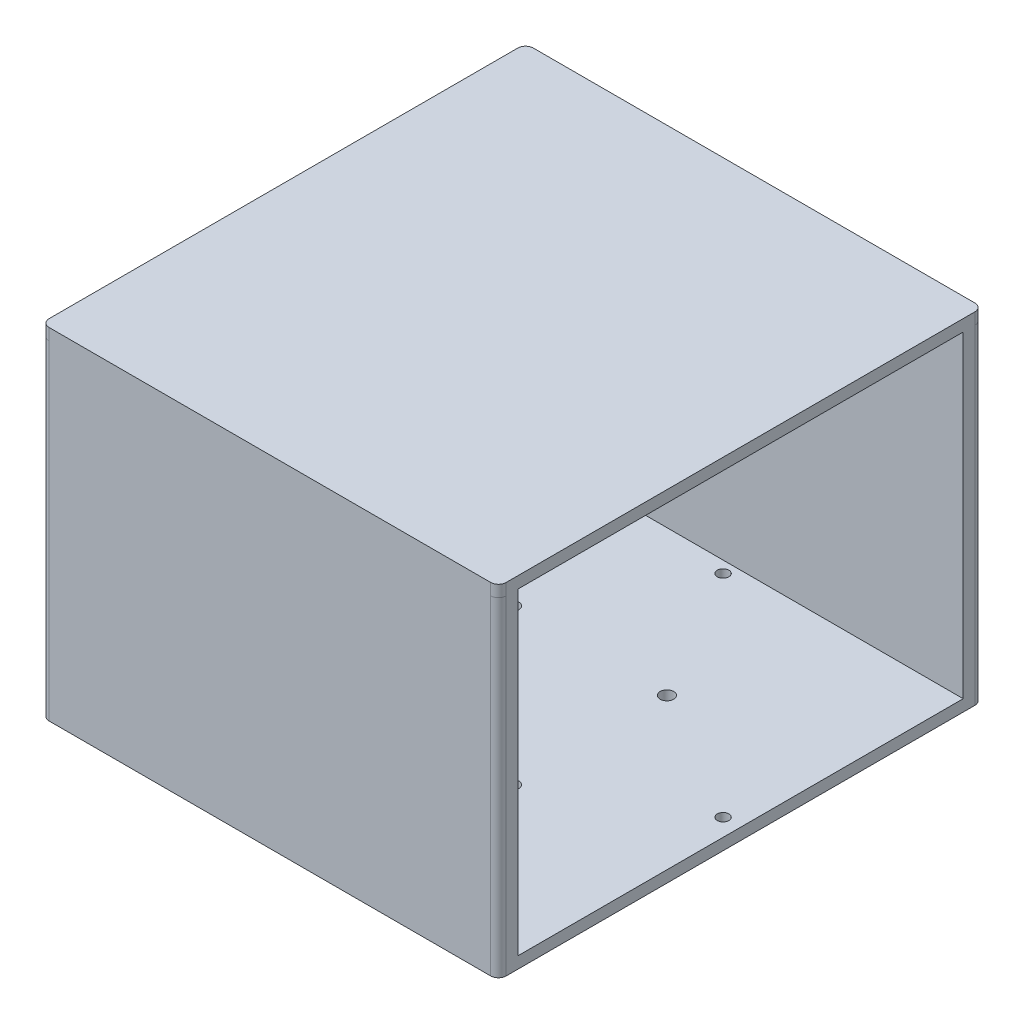
ISO-10303-21;
HEADER;
FILE_DESCRIPTION(('STEP AP214'),'2;1');
FILE_NAME('part.step','',(''),(''),'','','');
FILE_SCHEMA(('AUTOMOTIVE_DESIGN { 1 0 10303 214 1 1 1 1 }'));
ENDSEC;
DATA;
#1=APPLICATION_CONTEXT('core data for automotive mechanical design processes');
#2=APPLICATION_PROTOCOL_DEFINITION('international standard','automotive_design',2000,#1);
#3=PRODUCT_CONTEXT('',#1,'mechanical');
#4=PRODUCT('Part','Part','',(#3));
#5=PRODUCT_RELATED_PRODUCT_CATEGORY('part','',(#4));
#6=PRODUCT_DEFINITION_FORMATION('','',#4);
#7=PRODUCT_DEFINITION_CONTEXT('part definition',#1,'design');
#8=PRODUCT_DEFINITION('design','',#6,#7);
#9=PRODUCT_DEFINITION_SHAPE('','',#8);
#10=(LENGTH_UNIT() NAMED_UNIT(*) SI_UNIT(.MILLI.,.METRE.));
#11=(NAMED_UNIT(*) PLANE_ANGLE_UNIT() SI_UNIT($,.RADIAN.));
#12=(NAMED_UNIT(*) SI_UNIT($,.STERADIAN.) SOLID_ANGLE_UNIT());
#13=UNCERTAINTY_MEASURE_WITH_UNIT(LENGTH_MEASURE(1.E-05),#10,'distance_accuracy_value','');
#14=(GEOMETRIC_REPRESENTATION_CONTEXT(3) GLOBAL_UNCERTAINTY_ASSIGNED_CONTEXT((#13)) GLOBAL_UNIT_ASSIGNED_CONTEXT((#10,
#11,#12)) REPRESENTATION_CONTEXT('',''));
#15=CARTESIAN_POINT('',(0.,0.,0.));
#16=DIRECTION('',(0.,0.,1.));
#17=DIRECTION('',(1.,0.,0.));
#18=AXIS2_PLACEMENT_3D('',#15,#16,#17);
#19=CARTESIAN_POINT('',(0.,3.,0.));
#20=DIRECTION('',(0.,-1.,0.));
#21=DIRECTION('',(0.,0.,-1.));
#22=AXIS2_PLACEMENT_3D('',#19,#20,#21);
#23=PLANE('',#22);
#24=CARTESIAN_POINT('',(-20.,3.,20.));
#25=DIRECTION('',(0.,-1.,0.));
#26=DIRECTION('',(0.,0.,-1.));
#27=AXIS2_PLACEMENT_3D('',#24,#25,#26);
#28=CIRCLE('',#27,1.75);
#29=CARTESIAN_POINT('',(-20.,3.,18.25));
#30=VERTEX_POINT('',#29);
#31=EDGE_CURVE('E289',#30,#30,#28,.T.);
#32=ORIENTED_EDGE('',*,*,#31,.T.);
#33=EDGE_LOOP('',(#32));
#34=FACE_BOUND('',#33,.T.);
#35=CARTESIAN_POINT('',(20.,3.,20.));
#36=DIRECTION('',(0.,-1.,0.));
#37=DIRECTION('',(0.,0.,-1.));
#38=AXIS2_PLACEMENT_3D('',#35,#36,#37);
#39=CIRCLE('',#38,1.75);
#40=CARTESIAN_POINT('',(20.,3.,18.25));
#41=VERTEX_POINT('',#40);
#42=EDGE_CURVE('E294',#41,#41,#39,.T.);
#43=ORIENTED_EDGE('',*,*,#42,.T.);
#44=EDGE_LOOP('',(#43));
#45=FACE_BOUND('',#44,.T.);
#46=CARTESIAN_POINT('',(20.,3.,-20.));
#47=DIRECTION('',(0.,-1.,0.));
#48=DIRECTION('',(0.,0.,-1.));
#49=AXIS2_PLACEMENT_3D('',#46,#47,#48);
#50=CIRCLE('',#49,1.75);
#51=CARTESIAN_POINT('',(20.,3.,-21.75));
#52=VERTEX_POINT('',#51);
#53=EDGE_CURVE('E297',#52,#52,#50,.T.);
#54=ORIENTED_EDGE('',*,*,#53,.T.);
#55=EDGE_LOOP('',(#54));
#56=FACE_BOUND('',#55,.T.);
#57=CARTESIAN_POINT('',(-20.,3.,-20.));
#58=DIRECTION('',(0.,-1.,0.));
#59=DIRECTION('',(0.,0.,-1.));
#60=AXIS2_PLACEMENT_3D('',#57,#58,#59);
#61=CIRCLE('',#60,1.75);
#62=CARTESIAN_POINT('',(-20.,3.,-21.75));
#63=VERTEX_POINT('',#62);
#64=EDGE_CURVE('E300',#63,#63,#61,.T.);
#65=ORIENTED_EDGE('',*,*,#64,.T.);
#66=EDGE_LOOP('',(#65));
#67=FACE_BOUND('',#66,.T.);
#68=CARTESIAN_POINT('',(-54.5,3.,0.));
#69=DIRECTION('',(0.,1.,0.));
#70=DIRECTION('',(0.,0.,1.));
#71=AXIS2_PLACEMENT_3D('',#68,#69,#70);
#72=CIRCLE('',#71,1.5);
#73=CARTESIAN_POINT('',(-54.5,3.,1.5));
#74=VERTEX_POINT('',#73);
#75=EDGE_CURVE('E265',#74,#74,#72,.T.);
#76=ORIENTED_EDGE('',*,*,#75,.F.);
#77=EDGE_LOOP('',(#76));
#78=FACE_BOUND('',#77,.T.);
#79=CARTESIAN_POINT('',(0.,3.,-54.5));
#80=DIRECTION('',(0.,1.,0.));
#81=DIRECTION('',(0.,0.,1.));
#82=AXIS2_PLACEMENT_3D('',#79,#80,#81);
#83=CIRCLE('',#82,1.5);
#84=CARTESIAN_POINT('',(0.,3.,-53.));
#85=VERTEX_POINT('',#84);
#86=EDGE_CURVE('E272',#85,#85,#83,.T.);
#87=ORIENTED_EDGE('',*,*,#86,.F.);
#88=EDGE_LOOP('',(#87));
#89=FACE_BOUND('',#88,.T.);
#90=CARTESIAN_POINT('',(54.5,3.,0.));
#91=DIRECTION('',(0.,1.,0.));
#92=DIRECTION('',(0.,0.,1.));
#93=AXIS2_PLACEMENT_3D('',#90,#91,#92);
#94=CIRCLE('',#93,1.5);
#95=CARTESIAN_POINT('',(54.5,3.,1.5));
#96=VERTEX_POINT('',#95);
#97=EDGE_CURVE('E277',#96,#96,#94,.T.);
#98=ORIENTED_EDGE('',*,*,#97,.F.);
#99=EDGE_LOOP('',(#98));
#100=FACE_BOUND('',#99,.T.);
#101=CARTESIAN_POINT('',(0.,3.,54.5));
#102=DIRECTION('',(0.,1.,0.));
#103=DIRECTION('',(0.,0.,1.));
#104=AXIS2_PLACEMENT_3D('',#101,#102,#103);
#105=CIRCLE('',#104,1.5);
#106=CARTESIAN_POINT('',(0.,3.,56.));
#107=VERTEX_POINT('',#106);
#108=EDGE_CURVE('E283',#107,#107,#105,.T.);
#109=ORIENTED_EDGE('',*,*,#108,.F.);
#110=EDGE_LOOP('',(#109));
#111=FACE_BOUND('',#110,.T.);
#112=DIRECTION('',(1.,0.,0.));
#113=VECTOR('',#112,1.);
#114=CARTESIAN_POINT('',(59.,3.,-57.5));
#115=LINE('',#114,#113);
#116=CARTESIAN_POINT('',(-59.,3.,-57.5));
#117=VERTEX_POINT('',#116);
#118=CARTESIAN_POINT('',(59.,3.,-57.5));
#119=VERTEX_POINT('',#118);
#120=EDGE_CURVE('E334',#117,#119,#115,.T.);
#121=ORIENTED_EDGE('',*,*,#120,.F.);
#122=DIRECTION('',(0.,0.,1.));
#123=VECTOR('',#122,1.);
#124=CARTESIAN_POINT('',(-59.,3.,-62.5));
#125=LINE('',#124,#123);
#126=CARTESIAN_POINT('',(-59.,3.,57.5));
#127=VERTEX_POINT('',#126);
#128=EDGE_CURVE('E249',#117,#127,#125,.T.);
#129=ORIENTED_EDGE('',*,*,#128,.T.);
#130=DIRECTION('',(-1.,0.,0.));
#131=VECTOR('',#130,1.);
#132=CARTESIAN_POINT('',(59.,3.,57.5));
#133=LINE('',#132,#131);
#134=CARTESIAN_POINT('',(59.,3.,57.5));
#135=VERTEX_POINT('',#134);
#136=EDGE_CURVE('E322',#135,#127,#133,.T.);
#137=ORIENTED_EDGE('',*,*,#136,.F.);
#138=DIRECTION('',(0.,0.,-1.));
#139=VECTOR('',#138,1.);
#140=CARTESIAN_POINT('',(59.,3.,-62.5));
#141=LINE('',#140,#139);
#142=EDGE_CURVE('E254',#135,#119,#141,.T.);
#143=ORIENTED_EDGE('',*,*,#142,.T.);
#144=EDGE_LOOP('',(#121,#129,#137,#143));
#145=FACE_BOUND('',#144,.T.);
#146=ADVANCED_FACE('F33',(#34,#45,#56,#67,#78,#89,#100,#111,#145),#23,.F.);
#147=CARTESIAN_POINT('',(0.,0.,0.));
#148=DIRECTION('',(0.,-1.,0.));
#149=DIRECTION('',(0.,0.,-1.));
#150=AXIS2_PLACEMENT_3D('',#147,#148,#149);
#151=PLANE('',#150);
#152=CARTESIAN_POINT('',(-20.,0.,20.));
#153=DIRECTION('',(0.,-1.,0.));
#154=DIRECTION('',(0.,0.,-1.));
#155=AXIS2_PLACEMENT_3D('',#152,#153,#154);
#156=CIRCLE('',#155,1.75);
#157=CARTESIAN_POINT('',(-20.,0.,18.25));
#158=VERTEX_POINT('',#157);
#159=EDGE_CURVE('E307',#158,#158,#156,.T.);
#160=ORIENTED_EDGE('',*,*,#159,.F.);
#161=EDGE_LOOP('',(#160));
#162=FACE_BOUND('',#161,.T.);
#163=CARTESIAN_POINT('',(20.,0.,20.));
#164=DIRECTION('',(0.,-1.,0.));
#165=DIRECTION('',(0.,0.,-1.));
#166=AXIS2_PLACEMENT_3D('',#163,#164,#165);
#167=CIRCLE('',#166,1.75);
#168=CARTESIAN_POINT('',(20.,0.,18.25));
#169=VERTEX_POINT('',#168);
#170=EDGE_CURVE('E310',#169,#169,#167,.T.);
#171=ORIENTED_EDGE('',*,*,#170,.F.);
#172=EDGE_LOOP('',(#171));
#173=FACE_BOUND('',#172,.T.);
#174=CARTESIAN_POINT('',(20.,0.,-20.));
#175=DIRECTION('',(0.,-1.,0.));
#176=DIRECTION('',(0.,0.,-1.));
#177=AXIS2_PLACEMENT_3D('',#174,#175,#176);
#178=CIRCLE('',#177,1.75);
#179=CARTESIAN_POINT('',(20.,0.,-21.75));
#180=VERTEX_POINT('',#179);
#181=EDGE_CURVE('E306',#180,#180,#178,.T.);
#182=ORIENTED_EDGE('',*,*,#181,.F.);
#183=EDGE_LOOP('',(#182));
#184=FACE_BOUND('',#183,.T.);
#185=CARTESIAN_POINT('',(-20.,0.,-20.));
#186=DIRECTION('',(0.,-1.,0.));
#187=DIRECTION('',(0.,0.,-1.));
#188=AXIS2_PLACEMENT_3D('',#185,#186,#187);
#189=CIRCLE('',#188,1.75);
#190=CARTESIAN_POINT('',(-20.,0.,-21.75));
#191=VERTEX_POINT('',#190);
#192=EDGE_CURVE('E303',#191,#191,#189,.T.);
#193=ORIENTED_EDGE('',*,*,#192,.F.);
#194=EDGE_LOOP('',(#193));
#195=FACE_BOUND('',#194,.T.);
#196=CARTESIAN_POINT('',(54.5,0.,0.));
#197=DIRECTION('',(0.,1.,0.));
#198=DIRECTION('',(0.,0.,1.));
#199=AXIS2_PLACEMENT_3D('',#196,#197,#198);
#200=CIRCLE('',#199,1.5);
#201=CARTESIAN_POINT('',(54.5,0.,1.5));
#202=VERTEX_POINT('',#201);
#203=EDGE_CURVE('E280',#202,#202,#200,.T.);
#204=ORIENTED_EDGE('',*,*,#203,.T.);
#205=EDGE_LOOP('',(#204));
#206=FACE_BOUND('',#205,.T.);
#207=CARTESIAN_POINT('',(-54.5,0.,0.));
#208=DIRECTION('',(0.,1.,0.));
#209=DIRECTION('',(0.,0.,1.));
#210=AXIS2_PLACEMENT_3D('',#207,#208,#209);
#211=CIRCLE('',#210,1.5);
#212=CARTESIAN_POINT('',(-54.5,0.,1.5));
#213=VERTEX_POINT('',#212);
#214=EDGE_CURVE('E267',#213,#213,#211,.T.);
#215=ORIENTED_EDGE('',*,*,#214,.T.);
#216=EDGE_LOOP('',(#215));
#217=FACE_BOUND('',#216,.T.);
#218=DIRECTION('',(0.,0.,1.));
#219=VECTOR('',#218,1.);
#220=CARTESIAN_POINT('',(-59.,0.,-62.5));
#221=LINE('',#220,#219);
#222=CARTESIAN_POINT('',(-59.,0.,-60.5));
#223=VERTEX_POINT('',#222);
#224=CARTESIAN_POINT('',(-59.,0.,60.5));
#225=VERTEX_POINT('',#224);
#226=EDGE_CURVE('E251',#223,#225,#221,.T.);
#227=ORIENTED_EDGE('',*,*,#226,.F.);
#228=CARTESIAN_POINT('',(-57.,0.,-60.5));
#229=DIRECTION('',(0.,-1.,0.));
#230=DIRECTION('',(0.,0.,-1.));
#231=AXIS2_PLACEMENT_3D('',#228,#229,#230);
#232=CIRCLE('',#231,2.);
#233=CARTESIAN_POINT('',(-57.,0.,-62.5));
#234=VERTEX_POINT('',#233);
#235=EDGE_CURVE('E172',#223,#234,#232,.T.);
#236=ORIENTED_EDGE('',*,*,#235,.T.);
#237=DIRECTION('',(-1.,0.,0.));
#238=VECTOR('',#237,1.);
#239=CARTESIAN_POINT('',(59.,0.,-62.5));
#240=LINE('',#239,#238);
#241=CARTESIAN_POINT('',(57.,0.,-62.5));
#242=VERTEX_POINT('',#241);
#243=EDGE_CURVE('E246',#242,#234,#240,.T.);
#244=ORIENTED_EDGE('',*,*,#243,.F.);
#245=CARTESIAN_POINT('',(57.,0.,-60.5));
#246=DIRECTION('',(0.,-1.,0.));
#247=DIRECTION('',(0.,0.,-1.));
#248=AXIS2_PLACEMENT_3D('',#245,#246,#247);
#249=CIRCLE('',#248,2.);
#250=CARTESIAN_POINT('',(59.,0.,-60.5));
#251=VERTEX_POINT('',#250);
#252=EDGE_CURVE('E171',#242,#251,#249,.T.);
#253=ORIENTED_EDGE('',*,*,#252,.T.);
#254=DIRECTION('',(0.,0.,-1.));
#255=VECTOR('',#254,1.);
#256=CARTESIAN_POINT('',(59.,0.,-62.5));
#257=LINE('',#256,#255);
#258=CARTESIAN_POINT('',(59.,0.,60.5));
#259=VERTEX_POINT('',#258);
#260=EDGE_CURVE('E245',#259,#251,#257,.T.);
#261=ORIENTED_EDGE('',*,*,#260,.F.);
#262=CARTESIAN_POINT('',(57.,0.,60.5));
#263=DIRECTION('',(0.,-1.,0.));
#264=DIRECTION('',(0.,0.,-1.));
#265=AXIS2_PLACEMENT_3D('',#262,#263,#264);
#266=CIRCLE('',#265,2.);
#267=CARTESIAN_POINT('',(57.,0.,62.5));
#268=VERTEX_POINT('',#267);
#269=EDGE_CURVE('E231',#259,#268,#266,.T.);
#270=ORIENTED_EDGE('',*,*,#269,.T.);
#271=DIRECTION('',(1.,0.,0.));
#272=VECTOR('',#271,1.);
#273=CARTESIAN_POINT('',(59.,0.,62.5));
#274=LINE('',#273,#272);
#275=CARTESIAN_POINT('',(-57.,0.,62.5));
#276=VERTEX_POINT('',#275);
#277=EDGE_CURVE('E247',#276,#268,#274,.T.);
#278=ORIENTED_EDGE('',*,*,#277,.F.);
#279=CARTESIAN_POINT('',(-57.,0.,60.5));
#280=DIRECTION('',(0.,-1.,0.));
#281=DIRECTION('',(0.,0.,-1.));
#282=AXIS2_PLACEMENT_3D('',#279,#280,#281);
#283=CIRCLE('',#282,2.);
#284=EDGE_CURVE('E234',#276,#225,#283,.T.);
#285=ORIENTED_EDGE('',*,*,#284,.T.);
#286=EDGE_LOOP('',(#227,#236,#244,#253,#261,#270,#278,#285));
#287=FACE_BOUND('',#286,.T.);
#288=CARTESIAN_POINT('',(0.,0.,-54.5));
#289=DIRECTION('',(0.,1.,0.));
#290=DIRECTION('',(0.,0.,1.));
#291=AXIS2_PLACEMENT_3D('',#288,#289,#290);
#292=CIRCLE('',#291,1.5);
#293=CARTESIAN_POINT('',(0.,0.,-53.));
#294=VERTEX_POINT('',#293);
#295=EDGE_CURVE('E274',#294,#294,#292,.T.);
#296=ORIENTED_EDGE('',*,*,#295,.T.);
#297=EDGE_LOOP('',(#296));
#298=FACE_BOUND('',#297,.T.);
#299=CARTESIAN_POINT('',(0.,0.,54.5));
#300=DIRECTION('',(0.,1.,0.));
#301=DIRECTION('',(0.,0.,1.));
#302=AXIS2_PLACEMENT_3D('',#299,#300,#301);
#303=CIRCLE('',#302,1.5);
#304=CARTESIAN_POINT('',(0.,0.,56.));
#305=VERTEX_POINT('',#304);
#306=EDGE_CURVE('E286',#305,#305,#303,.T.);
#307=ORIENTED_EDGE('',*,*,#306,.T.);
#308=EDGE_LOOP('',(#307));
#309=FACE_BOUND('',#308,.T.);
#310=ADVANCED_FACE('F243',(#162,#173,#184,#195,#206,#217,#287,#298,#309),#151,.T.);
#311=CARTESIAN_POINT('',(-59.,3.,-62.5));
#312=DIRECTION('',(1.,0.,0.));
#313=DIRECTION('',(0.,0.,-1.));
#314=AXIS2_PLACEMENT_3D('',#311,#312,#313);
#315=PLANE('',#314);
#316=DIRECTION('',(0.,0.,1.));
#317=VECTOR('',#316,1.);
#318=CARTESIAN_POINT('',(-59.,88.,-62.5));
#319=LINE('',#318,#317);
#320=CARTESIAN_POINT('',(-59.,88.,-60.5));
#321=VERTEX_POINT('',#320);
#322=CARTESIAN_POINT('',(-59.,88.,60.5));
#323=VERTEX_POINT('',#322);
#324=EDGE_CURVE('E222',#321,#323,#319,.T.);
#325=ORIENTED_EDGE('',*,*,#324,.F.);
#326=DIRECTION('',(0.,-1.,0.));
#327=VECTOR('',#326,1.);
#328=CARTESIAN_POINT('',(-59.,3.,-60.5));
#329=LINE('',#328,#327);
#330=CARTESIAN_POINT('',(-59.,85.,-60.5));
#331=VERTEX_POINT('',#330);
#332=EDGE_CURVE('E168',#321,#331,#329,.T.);
#333=ORIENTED_EDGE('',*,*,#332,.T.);
#334=DIRECTION('',(0.,-1.,0.));
#335=VECTOR('',#334,1.);
#336=CARTESIAN_POINT('',(-59.,3.,-60.5));
#337=LINE('',#336,#335);
#338=EDGE_CURVE('E235',#331,#223,#337,.T.);
#339=ORIENTED_EDGE('',*,*,#338,.T.);
#340=ORIENTED_EDGE('',*,*,#226,.T.);
#341=DIRECTION('',(0.,-1.,0.));
#342=VECTOR('',#341,1.);
#343=CARTESIAN_POINT('',(-59.,3.,60.5));
#344=LINE('',#343,#342);
#345=CARTESIAN_POINT('',(-59.,85.,60.5));
#346=VERTEX_POINT('',#345);
#347=EDGE_CURVE('E239',#225,#346,#344,.F.);
#348=ORIENTED_EDGE('',*,*,#347,.T.);
#349=DIRECTION('',(0.,-1.,0.));
#350=VECTOR('',#349,1.);
#351=CARTESIAN_POINT('',(-59.,3.,60.5));
#352=LINE('',#351,#350);
#353=EDGE_CURVE('E193',#346,#323,#352,.F.);
#354=ORIENTED_EDGE('',*,*,#353,.T.);
#355=EDGE_LOOP('',(#325,#333,#339,#340,#348,#354));
#356=FACE_BOUND('',#355,.T.);
#357=DIRECTION('',(0.,-1.,0.));
#358=VECTOR('',#357,1.);
#359=CARTESIAN_POINT('',(-59.,85.,-57.5));
#360=LINE('',#359,#358);
#361=CARTESIAN_POINT('',(-59.,85.,-57.5));
#362=VERTEX_POINT('',#361);
#363=EDGE_CURVE('E325',#362,#117,#360,.T.);
#364=ORIENTED_EDGE('',*,*,#363,.F.);
#365=DIRECTION('',(0.,0.,1.));
#366=VECTOR('',#365,1.);
#367=CARTESIAN_POINT('',(-59.,85.,-62.5));
#368=LINE('',#367,#366);
#369=CARTESIAN_POINT('',(-59.,85.,57.5));
#370=VERTEX_POINT('',#369);
#371=EDGE_CURVE('E341',#362,#370,#368,.T.);
#372=ORIENTED_EDGE('',*,*,#371,.T.);
#373=DIRECTION('',(0.,-1.,0.));
#374=VECTOR('',#373,1.);
#375=CARTESIAN_POINT('',(-59.,85.,57.5));
#376=LINE('',#375,#374);
#377=EDGE_CURVE('E318',#370,#127,#376,.T.);
#378=ORIENTED_EDGE('',*,*,#377,.T.);
#379=ORIENTED_EDGE('',*,*,#128,.F.);
#380=EDGE_LOOP('',(#364,#372,#378,#379));
#381=FACE_BOUND('',#380,.T.);
#382=ADVANCED_FACE('F363',(#356,#381),#315,.F.);
#383=CARTESIAN_POINT('',(59.,3.,62.5));
#384=DIRECTION('',(0.,0.,-1.));
#385=DIRECTION('',(-1.,0.,0.));
#386=AXIS2_PLACEMENT_3D('',#383,#384,#385);
#387=PLANE('',#386);
#388=DIRECTION('',(1.,0.,0.));
#389=VECTOR('',#388,1.);
#390=CARTESIAN_POINT('',(59.,88.,62.5));
#391=LINE('',#390,#389);
#392=CARTESIAN_POINT('',(-57.,88.,62.5));
#393=VERTEX_POINT('',#392);
#394=CARTESIAN_POINT('',(57.,88.,62.5));
#395=VERTEX_POINT('',#394);
#396=EDGE_CURVE('E212',#393,#395,#391,.T.);
#397=ORIENTED_EDGE('',*,*,#396,.F.);
#398=DIRECTION('',(0.,-1.,0.));
#399=VECTOR('',#398,1.);
#400=CARTESIAN_POINT('',(-57.,3.,62.5));
#401=LINE('',#400,#399);
#402=CARTESIAN_POINT('',(-57.,85.,62.5));
#403=VERTEX_POINT('',#402);
#404=EDGE_CURVE('E11',#393,#403,#401,.T.);
#405=ORIENTED_EDGE('',*,*,#404,.T.);
#406=DIRECTION('',(0.,-1.,0.));
#407=VECTOR('',#406,1.);
#408=CARTESIAN_POINT('',(-57.,3.,62.5));
#409=LINE('',#408,#407);
#410=EDGE_CURVE('E186',#403,#276,#409,.T.);
#411=ORIENTED_EDGE('',*,*,#410,.T.);
#412=ORIENTED_EDGE('',*,*,#277,.T.);
#413=DIRECTION('',(0.,-1.,0.));
#414=VECTOR('',#413,1.);
#415=CARTESIAN_POINT('',(57.,3.,62.5));
#416=LINE('',#415,#414);
#417=CARTESIAN_POINT('',(57.,85.,62.5));
#418=VERTEX_POINT('',#417);
#419=EDGE_CURVE('E184',#268,#418,#416,.F.);
#420=ORIENTED_EDGE('',*,*,#419,.T.);
#421=DIRECTION('',(0.,-1.,0.));
#422=VECTOR('',#421,1.);
#423=CARTESIAN_POINT('',(57.,3.,62.5));
#424=LINE('',#423,#422);
#425=EDGE_CURVE('E41',#418,#395,#424,.F.);
#426=ORIENTED_EDGE('',*,*,#425,.T.);
#427=EDGE_LOOP('',(#397,#405,#411,#412,#420,#426));
#428=FACE_BOUND('',#427,.T.);
#429=ADVANCED_FACE('F211',(#428),#387,.F.);
#430=CARTESIAN_POINT('',(59.,3.,-62.5));
#431=DIRECTION('',(-1.,0.,0.));
#432=DIRECTION('',(0.,0.,1.));
#433=AXIS2_PLACEMENT_3D('',#430,#431,#432);
#434=PLANE('',#433);
#435=DIRECTION('',(0.,-1.,0.));
#436=VECTOR('',#435,1.);
#437=CARTESIAN_POINT('',(59.,85.,57.5));
#438=LINE('',#437,#436);
#439=CARTESIAN_POINT('',(59.,85.,57.5));
#440=VERTEX_POINT('',#439);
#441=EDGE_CURVE('E311',#440,#135,#438,.T.);
#442=ORIENTED_EDGE('',*,*,#441,.F.);
#443=DIRECTION('',(0.,0.,-1.));
#444=VECTOR('',#443,1.);
#445=CARTESIAN_POINT('',(59.,85.,-62.5));
#446=LINE('',#445,#444);
#447=CARTESIAN_POINT('',(59.,85.,-57.5));
#448=VERTEX_POINT('',#447);
#449=EDGE_CURVE('E338',#440,#448,#446,.T.);
#450=ORIENTED_EDGE('',*,*,#449,.T.);
#451=DIRECTION('',(0.,-1.,0.));
#452=VECTOR('',#451,1.);
#453=CARTESIAN_POINT('',(59.,85.,-57.5));
#454=LINE('',#453,#452);
#455=EDGE_CURVE('E330',#448,#119,#454,.T.);
#456=ORIENTED_EDGE('',*,*,#455,.T.);
#457=ORIENTED_EDGE('',*,*,#142,.F.);
#458=EDGE_LOOP('',(#442,#450,#456,#457));
#459=FACE_BOUND('',#458,.T.);
#460=DIRECTION('',(0.,-1.,0.));
#461=VECTOR('',#460,1.);
#462=CARTESIAN_POINT('',(59.,3.,-60.5));
#463=LINE('',#462,#461);
#464=CARTESIAN_POINT('',(59.,85.,-60.5));
#465=VERTEX_POINT('',#464);
#466=EDGE_CURVE('E182',#251,#465,#463,.F.);
#467=ORIENTED_EDGE('',*,*,#466,.T.);
#468=DIRECTION('',(0.,-1.,0.));
#469=VECTOR('',#468,1.);
#470=CARTESIAN_POINT('',(59.,3.,-60.5));
#471=LINE('',#470,#469);
#472=CARTESIAN_POINT('',(59.,88.,-60.5));
#473=VERTEX_POINT('',#472);
#474=EDGE_CURVE('E48',#465,#473,#471,.F.);
#475=ORIENTED_EDGE('',*,*,#474,.T.);
#476=DIRECTION('',(0.,0.,-1.));
#477=VECTOR('',#476,1.);
#478=CARTESIAN_POINT('',(59.,88.,-62.5));
#479=LINE('',#478,#477);
#480=CARTESIAN_POINT('',(59.,88.,60.5));
#481=VERTEX_POINT('',#480);
#482=EDGE_CURVE('E221',#481,#473,#479,.T.);
#483=ORIENTED_EDGE('',*,*,#482,.F.);
#484=DIRECTION('',(0.,-1.,0.));
#485=VECTOR('',#484,1.);
#486=CARTESIAN_POINT('',(59.,3.,60.5));
#487=LINE('',#486,#485);
#488=CARTESIAN_POINT('',(59.,85.,60.5));
#489=VERTEX_POINT('',#488);
#490=EDGE_CURVE('E205',#481,#489,#487,.T.);
#491=ORIENTED_EDGE('',*,*,#490,.T.);
#492=DIRECTION('',(0.,-1.,0.));
#493=VECTOR('',#492,1.);
#494=CARTESIAN_POINT('',(59.,3.,60.5));
#495=LINE('',#494,#493);
#496=EDGE_CURVE('E179',#489,#259,#495,.T.);
#497=ORIENTED_EDGE('',*,*,#496,.T.);
#498=ORIENTED_EDGE('',*,*,#260,.T.);
#499=EDGE_LOOP('',(#467,#475,#483,#491,#497,#498));
#500=FACE_BOUND('',#499,.T.);
#501=ADVANCED_FACE('F226',(#459,#500),#434,.F.);
#502=CARTESIAN_POINT('',(59.,3.,-62.5));
#503=DIRECTION('',(0.,0.,1.));
#504=DIRECTION('',(1.,0.,0.));
#505=AXIS2_PLACEMENT_3D('',#502,#503,#504);
#506=PLANE('',#505);
#507=DIRECTION('',(0.,-1.,0.));
#508=VECTOR('',#507,1.);
#509=CARTESIAN_POINT('',(-57.,3.,-62.5));
#510=LINE('',#509,#508);
#511=CARTESIAN_POINT('',(-57.,85.,-62.5));
#512=VERTEX_POINT('',#511);
#513=EDGE_CURVE('E156',#234,#512,#510,.F.);
#514=ORIENTED_EDGE('',*,*,#513,.T.);
#515=DIRECTION('',(0.,-1.,0.));
#516=VECTOR('',#515,1.);
#517=CARTESIAN_POINT('',(-57.,3.,-62.5));
#518=LINE('',#517,#516);
#519=CARTESIAN_POINT('',(-57.,88.,-62.5));
#520=VERTEX_POINT('',#519);
#521=EDGE_CURVE('E167',#512,#520,#518,.F.);
#522=ORIENTED_EDGE('',*,*,#521,.T.);
#523=DIRECTION('',(-1.,0.,0.));
#524=VECTOR('',#523,1.);
#525=CARTESIAN_POINT('',(59.,88.,-62.5));
#526=LINE('',#525,#524);
#527=CARTESIAN_POINT('',(57.,88.,-62.5));
#528=VERTEX_POINT('',#527);
#529=EDGE_CURVE('E166',#528,#520,#526,.T.);
#530=ORIENTED_EDGE('',*,*,#529,.F.);
#531=DIRECTION('',(0.,-1.,0.));
#532=VECTOR('',#531,1.);
#533=CARTESIAN_POINT('',(57.,3.,-62.5));
#534=LINE('',#533,#532);
#535=CARTESIAN_POINT('',(57.,85.,-62.5));
#536=VERTEX_POINT('',#535);
#537=EDGE_CURVE('E151',#528,#536,#534,.T.);
#538=ORIENTED_EDGE('',*,*,#537,.T.);
#539=DIRECTION('',(0.,-1.,0.));
#540=VECTOR('',#539,1.);
#541=CARTESIAN_POINT('',(57.,3.,-62.5));
#542=LINE('',#541,#540);
#543=EDGE_CURVE('E163',#536,#242,#542,.T.);
#544=ORIENTED_EDGE('',*,*,#543,.T.);
#545=ORIENTED_EDGE('',*,*,#243,.T.);
#546=EDGE_LOOP('',(#514,#522,#530,#538,#544,#545));
#547=FACE_BOUND('',#546,.T.);
#548=ADVANCED_FACE('F161',(#547),#506,.F.);
#549=CARTESIAN_POINT('',(-54.5,3.,0.));
#550=DIRECTION('',(0.,-1.,0.));
#551=DIRECTION('',(0.,0.,-1.));
#552=AXIS2_PLACEMENT_3D('',#549,#550,#551);
#553=CYLINDRICAL_SURFACE('',#552,1.5);
#554=ORIENTED_EDGE('',*,*,#75,.T.);
#555=EDGE_LOOP('',(#554));
#556=FACE_BOUND('',#555,.T.);
#557=ORIENTED_EDGE('',*,*,#214,.F.);
#558=EDGE_LOOP('',(#557));
#559=FACE_BOUND('',#558,.T.);
#560=ADVANCED_FACE('F385',(#556,#559),#553,.F.);
#561=CARTESIAN_POINT('',(0.,3.,-54.5));
#562=DIRECTION('',(0.,-1.,0.));
#563=DIRECTION('',(0.,0.,-1.));
#564=AXIS2_PLACEMENT_3D('',#561,#562,#563);
#565=CYLINDRICAL_SURFACE('',#564,1.5);
#566=ORIENTED_EDGE('',*,*,#86,.T.);
#567=EDGE_LOOP('',(#566));
#568=FACE_BOUND('',#567,.T.);
#569=ORIENTED_EDGE('',*,*,#295,.F.);
#570=EDGE_LOOP('',(#569));
#571=FACE_BOUND('',#570,.T.);
#572=ADVANCED_FACE('F400',(#568,#571),#565,.F.);
#573=CARTESIAN_POINT('',(54.5,3.,0.));
#574=DIRECTION('',(0.,-1.,0.));
#575=DIRECTION('',(0.,0.,-1.));
#576=AXIS2_PLACEMENT_3D('',#573,#574,#575);
#577=CYLINDRICAL_SURFACE('',#576,1.5);
#578=ORIENTED_EDGE('',*,*,#97,.T.);
#579=EDGE_LOOP('',(#578));
#580=FACE_BOUND('',#579,.T.);
#581=ORIENTED_EDGE('',*,*,#203,.F.);
#582=EDGE_LOOP('',(#581));
#583=FACE_BOUND('',#582,.T.);
#584=ADVANCED_FACE('F403',(#580,#583),#577,.F.);
#585=CARTESIAN_POINT('',(0.,3.,54.5));
#586=DIRECTION('',(0.,-1.,0.));
#587=DIRECTION('',(0.,0.,-1.));
#588=AXIS2_PLACEMENT_3D('',#585,#586,#587);
#589=CYLINDRICAL_SURFACE('',#588,1.5);
#590=ORIENTED_EDGE('',*,*,#108,.T.);
#591=EDGE_LOOP('',(#590));
#592=FACE_BOUND('',#591,.T.);
#593=ORIENTED_EDGE('',*,*,#306,.F.);
#594=EDGE_LOOP('',(#593));
#595=FACE_BOUND('',#594,.T.);
#596=ADVANCED_FACE('F407',(#592,#595),#589,.F.);
#597=CARTESIAN_POINT('',(-20.,10.,-20.));
#598=DIRECTION('',(0.,-1.,0.));
#599=DIRECTION('',(0.,0.,-1.));
#600=AXIS2_PLACEMENT_3D('',#597,#598,#599);
#601=CYLINDRICAL_SURFACE('',#600,1.75);
#602=ORIENTED_EDGE('',*,*,#192,.T.);
#603=EDGE_LOOP('',(#602));
#604=FACE_BOUND('',#603,.T.);
#605=ORIENTED_EDGE('',*,*,#64,.F.);
#606=EDGE_LOOP('',(#605));
#607=FACE_BOUND('',#606,.T.);
#608=ADVANCED_FACE('F411',(#604,#607),#601,.F.);
#609=CARTESIAN_POINT('',(20.,10.,-20.));
#610=DIRECTION('',(0.,-1.,0.));
#611=DIRECTION('',(0.,0.,-1.));
#612=AXIS2_PLACEMENT_3D('',#609,#610,#611);
#613=CYLINDRICAL_SURFACE('',#612,1.75);
#614=ORIENTED_EDGE('',*,*,#181,.T.);
#615=EDGE_LOOP('',(#614));
#616=FACE_BOUND('',#615,.T.);
#617=ORIENTED_EDGE('',*,*,#53,.F.);
#618=EDGE_LOOP('',(#617));
#619=FACE_BOUND('',#618,.T.);
#620=ADVANCED_FACE('F415',(#616,#619),#613,.F.);
#621=CARTESIAN_POINT('',(20.,10.,20.));
#622=DIRECTION('',(0.,-1.,0.));
#623=DIRECTION('',(0.,0.,-1.));
#624=AXIS2_PLACEMENT_3D('',#621,#622,#623);
#625=CYLINDRICAL_SURFACE('',#624,1.75);
#626=ORIENTED_EDGE('',*,*,#170,.T.);
#627=EDGE_LOOP('',(#626));
#628=FACE_BOUND('',#627,.T.);
#629=ORIENTED_EDGE('',*,*,#42,.F.);
#630=EDGE_LOOP('',(#629));
#631=FACE_BOUND('',#630,.T.);
#632=ADVANCED_FACE('F420',(#628,#631),#625,.F.);
#633=CARTESIAN_POINT('',(-20.,10.,20.));
#634=DIRECTION('',(0.,-1.,0.));
#635=DIRECTION('',(0.,0.,-1.));
#636=AXIS2_PLACEMENT_3D('',#633,#634,#635);
#637=CYLINDRICAL_SURFACE('',#636,1.75);
#638=ORIENTED_EDGE('',*,*,#159,.T.);
#639=EDGE_LOOP('',(#638));
#640=FACE_BOUND('',#639,.T.);
#641=ORIENTED_EDGE('',*,*,#31,.F.);
#642=EDGE_LOOP('',(#641));
#643=FACE_BOUND('',#642,.T.);
#644=ADVANCED_FACE('F417',(#640,#643),#637,.F.);
#645=CARTESIAN_POINT('',(59.,85.,57.5));
#646=DIRECTION('',(0.,0.,1.));
#647=DIRECTION('',(1.,0.,0.));
#648=AXIS2_PLACEMENT_3D('',#645,#646,#647);
#649=PLANE('',#648);
#650=ORIENTED_EDGE('',*,*,#136,.T.);
#651=ORIENTED_EDGE('',*,*,#377,.F.);
#652=DIRECTION('',(-1.,0.,0.));
#653=VECTOR('',#652,1.);
#654=CARTESIAN_POINT('',(59.,85.,57.5));
#655=LINE('',#654,#653);
#656=EDGE_CURVE('E321',#440,#370,#655,.T.);
#657=ORIENTED_EDGE('',*,*,#656,.F.);
#658=ORIENTED_EDGE('',*,*,#441,.T.);
#659=EDGE_LOOP('',(#650,#651,#657,#658));
#660=FACE_BOUND('',#659,.T.);
#661=ADVANCED_FACE('F377',(#660),#649,.F.);
#662=CARTESIAN_POINT('',(59.,85.,-57.5));
#663=DIRECTION('',(0.,0.,-1.));
#664=DIRECTION('',(-1.,0.,0.));
#665=AXIS2_PLACEMENT_3D('',#662,#663,#664);
#666=PLANE('',#665);
#667=ORIENTED_EDGE('',*,*,#120,.T.);
#668=ORIENTED_EDGE('',*,*,#455,.F.);
#669=DIRECTION('',(1.,0.,0.));
#670=VECTOR('',#669,1.);
#671=CARTESIAN_POINT('',(59.,85.,-57.5));
#672=LINE('',#671,#670);
#673=EDGE_CURVE('E333',#362,#448,#672,.T.);
#674=ORIENTED_EDGE('',*,*,#673,.F.);
#675=ORIENTED_EDGE('',*,*,#363,.T.);
#676=EDGE_LOOP('',(#667,#668,#674,#675));
#677=FACE_BOUND('',#676,.T.);
#678=ADVANCED_FACE('F371',(#677),#666,.F.);
#679=CARTESIAN_POINT('',(-57.,3.,-60.5));
#680=DIRECTION('',(0.,-1.,0.));
#681=DIRECTION('',(0.,0.,-1.));
#682=AXIS2_PLACEMENT_3D('',#679,#680,#681);
#683=CYLINDRICAL_SURFACE('',#682,2.);
#684=CARTESIAN_POINT('',(-57.,85.,-60.5));
#685=DIRECTION('',(0.,-1.,0.));
#686=DIRECTION('',(0.,0.,-1.));
#687=AXIS2_PLACEMENT_3D('',#684,#685,#686);
#688=CIRCLE('',#687,2.);
#689=EDGE_CURVE('E155',#512,#331,#688,.F.);
#690=ORIENTED_EDGE('',*,*,#689,.F.);
#691=ORIENTED_EDGE('',*,*,#513,.F.);
#692=ORIENTED_EDGE('',*,*,#235,.F.);
#693=ORIENTED_EDGE('',*,*,#338,.F.);
#694=EDGE_LOOP('',(#690,#691,#692,#693));
#695=FACE_BOUND('',#694,.T.);
#696=ADVANCED_FACE('F359',(#695),#683,.T.);
#697=CARTESIAN_POINT('',(57.,3.,-60.5));
#698=DIRECTION('',(0.,-1.,0.));
#699=DIRECTION('',(0.,0.,-1.));
#700=AXIS2_PLACEMENT_3D('',#697,#698,#699);
#701=CYLINDRICAL_SURFACE('',#700,2.);
#702=CARTESIAN_POINT('',(57.,85.,-60.5));
#703=DIRECTION('',(0.,-1.,0.));
#704=DIRECTION('',(0.,0.,-1.));
#705=AXIS2_PLACEMENT_3D('',#702,#703,#704);
#706=CIRCLE('',#705,2.);
#707=EDGE_CURVE('E147',#465,#536,#706,.F.);
#708=ORIENTED_EDGE('',*,*,#707,.F.);
#709=ORIENTED_EDGE('',*,*,#466,.F.);
#710=ORIENTED_EDGE('',*,*,#252,.F.);
#711=ORIENTED_EDGE('',*,*,#543,.F.);
#712=EDGE_LOOP('',(#708,#709,#710,#711));
#713=FACE_BOUND('',#712,.T.);
#714=ADVANCED_FACE('F170',(#713),#701,.T.);
#715=CARTESIAN_POINT('',(-57.,3.,60.5));
#716=DIRECTION('',(0.,-1.,0.));
#717=DIRECTION('',(0.,0.,-1.));
#718=AXIS2_PLACEMENT_3D('',#715,#716,#717);
#719=CYLINDRICAL_SURFACE('',#718,2.);
#720=CARTESIAN_POINT('',(-57.,85.,60.5));
#721=DIRECTION('',(0.,1.,0.));
#722=DIRECTION('',(0.,0.,1.));
#723=AXIS2_PLACEMENT_3D('',#720,#721,#722);
#724=CIRCLE('',#723,2.);
#725=EDGE_CURVE('E191',#346,#403,#724,.T.);
#726=ORIENTED_EDGE('',*,*,#725,.F.);
#727=ORIENTED_EDGE('',*,*,#347,.F.);
#728=ORIENTED_EDGE('',*,*,#284,.F.);
#729=ORIENTED_EDGE('',*,*,#410,.F.);
#730=EDGE_LOOP('',(#726,#727,#728,#729));
#731=FACE_BOUND('',#730,.T.);
#732=ADVANCED_FACE('F354',(#731),#719,.T.);
#733=CARTESIAN_POINT('',(57.,3.,60.5));
#734=DIRECTION('',(0.,-1.,0.));
#735=DIRECTION('',(0.,0.,-1.));
#736=AXIS2_PLACEMENT_3D('',#733,#734,#735);
#737=CYLINDRICAL_SURFACE('',#736,2.);
#738=CARTESIAN_POINT('',(57.,85.,60.5));
#739=DIRECTION('',(0.,1.,0.));
#740=DIRECTION('',(0.,0.,1.));
#741=AXIS2_PLACEMENT_3D('',#738,#739,#740);
#742=CIRCLE('',#741,2.);
#743=EDGE_CURVE('E189',#418,#489,#742,.T.);
#744=ORIENTED_EDGE('',*,*,#743,.F.);
#745=ORIENTED_EDGE('',*,*,#419,.F.);
#746=ORIENTED_EDGE('',*,*,#269,.F.);
#747=ORIENTED_EDGE('',*,*,#496,.F.);
#748=EDGE_LOOP('',(#744,#745,#746,#747));
#749=FACE_BOUND('',#748,.T.);
#750=ADVANCED_FACE('F230',(#749),#737,.T.);
#751=CARTESIAN_POINT('',(0.,85.,0.));
#752=DIRECTION('',(0.,-1.,0.));
#753=DIRECTION('',(0.,0.,-1.));
#754=AXIS2_PLACEMENT_3D('',#751,#752,#753);
#755=PLANE('',#754);
#756=ORIENTED_EDGE('',*,*,#656,.T.);
#757=ORIENTED_EDGE('',*,*,#371,.F.);
#758=ORIENTED_EDGE('',*,*,#673,.T.);
#759=ORIENTED_EDGE('',*,*,#449,.F.);
#760=EDGE_LOOP('',(#756,#757,#758,#759));
#761=FACE_BOUND('',#760,.T.);
#762=ADVANCED_FACE('F374',(#761),#755,.T.);
#763=CARTESIAN_POINT('',(0.,88.,0.));
#764=DIRECTION('',(0.,-1.,0.));
#765=DIRECTION('',(0.,0.,-1.));
#766=AXIS2_PLACEMENT_3D('',#763,#764,#765);
#767=PLANE('',#766);
#768=ORIENTED_EDGE('',*,*,#529,.T.);
#769=CARTESIAN_POINT('',(-57.,88.,-60.5));
#770=DIRECTION('',(0.,-1.,0.));
#771=DIRECTION('',(0.,0.,-1.));
#772=AXIS2_PLACEMENT_3D('',#769,#770,#771);
#773=CIRCLE('',#772,2.);
#774=EDGE_CURVE('E203',#520,#321,#773,.F.);
#775=ORIENTED_EDGE('',*,*,#774,.T.);
#776=ORIENTED_EDGE('',*,*,#324,.T.);
#777=CARTESIAN_POINT('',(-57.,88.,60.5));
#778=DIRECTION('',(0.,-1.,0.));
#779=DIRECTION('',(0.,0.,-1.));
#780=AXIS2_PLACEMENT_3D('',#777,#778,#779);
#781=CIRCLE('',#780,2.);
#782=EDGE_CURVE('E199',#323,#393,#781,.F.);
#783=ORIENTED_EDGE('',*,*,#782,.T.);
#784=ORIENTED_EDGE('',*,*,#396,.T.);
#785=CARTESIAN_POINT('',(57.,88.,60.5));
#786=DIRECTION('',(0.,-1.,0.));
#787=DIRECTION('',(0.,0.,-1.));
#788=AXIS2_PLACEMENT_3D('',#785,#786,#787);
#789=CIRCLE('',#788,2.);
#790=EDGE_CURVE('E55',#395,#481,#789,.F.);
#791=ORIENTED_EDGE('',*,*,#790,.T.);
#792=ORIENTED_EDGE('',*,*,#482,.T.);
#793=CARTESIAN_POINT('',(57.,88.,-60.5));
#794=DIRECTION('',(0.,-1.,0.));
#795=DIRECTION('',(0.,0.,-1.));
#796=AXIS2_PLACEMENT_3D('',#793,#794,#795);
#797=CIRCLE('',#796,2.);
#798=EDGE_CURVE('E201',#473,#528,#797,.F.);
#799=ORIENTED_EDGE('',*,*,#798,.T.);
#800=EDGE_LOOP('',(#768,#775,#776,#783,#784,#791,#792,#799));
#801=FACE_BOUND('',#800,.T.);
#802=ADVANCED_FACE('F218',(#801),#767,.F.);
#803=CARTESIAN_POINT('',(-57.,3.,-60.5));
#804=DIRECTION('',(0.,-1.,0.));
#805=DIRECTION('',(0.,0.,-1.));
#806=AXIS2_PLACEMENT_3D('',#803,#804,#805);
#807=CYLINDRICAL_SURFACE('',#806,2.);
#808=ORIENTED_EDGE('',*,*,#774,.F.);
#809=ORIENTED_EDGE('',*,*,#521,.F.);
#810=ORIENTED_EDGE('',*,*,#689,.T.);
#811=ORIENTED_EDGE('',*,*,#332,.F.);
#812=EDGE_LOOP('',(#808,#809,#810,#811));
#813=FACE_BOUND('',#812,.T.);
#814=ADVANCED_FACE('F362',(#813),#807,.T.);
#815=CARTESIAN_POINT('',(57.,3.,-60.5));
#816=DIRECTION('',(0.,-1.,0.));
#817=DIRECTION('',(0.,0.,-1.));
#818=AXIS2_PLACEMENT_3D('',#815,#816,#817);
#819=CYLINDRICAL_SURFACE('',#818,2.);
#820=ORIENTED_EDGE('',*,*,#798,.F.);
#821=ORIENTED_EDGE('',*,*,#474,.F.);
#822=ORIENTED_EDGE('',*,*,#707,.T.);
#823=ORIENTED_EDGE('',*,*,#537,.F.);
#824=EDGE_LOOP('',(#820,#821,#822,#823));
#825=FACE_BOUND('',#824,.T.);
#826=ADVANCED_FACE('F150',(#825),#819,.T.);
#827=CARTESIAN_POINT('',(-57.,3.,60.5));
#828=DIRECTION('',(0.,-1.,0.));
#829=DIRECTION('',(0.,0.,-1.));
#830=AXIS2_PLACEMENT_3D('',#827,#828,#829);
#831=CYLINDRICAL_SURFACE('',#830,2.);
#832=ORIENTED_EDGE('',*,*,#782,.F.);
#833=ORIENTED_EDGE('',*,*,#353,.F.);
#834=ORIENTED_EDGE('',*,*,#725,.T.);
#835=ORIENTED_EDGE('',*,*,#404,.F.);
#836=EDGE_LOOP('',(#832,#833,#834,#835));
#837=FACE_BOUND('',#836,.T.);
#838=ADVANCED_FACE('F351',(#837),#831,.T.);
#839=CARTESIAN_POINT('',(57.,3.,60.5));
#840=DIRECTION('',(0.,-1.,0.));
#841=DIRECTION('',(0.,0.,-1.));
#842=AXIS2_PLACEMENT_3D('',#839,#840,#841);
#843=CYLINDRICAL_SURFACE('',#842,2.);
#844=ORIENTED_EDGE('',*,*,#790,.F.);
#845=ORIENTED_EDGE('',*,*,#425,.F.);
#846=ORIENTED_EDGE('',*,*,#743,.T.);
#847=ORIENTED_EDGE('',*,*,#490,.F.);
#848=EDGE_LOOP('',(#844,#845,#846,#847));
#849=FACE_BOUND('',#848,.T.);
#850=ADVANCED_FACE('F35',(#849),#843,.T.);
#851=CLOSED_SHELL('',(#146,#310,#382,#429,#501,#548,#560,#572,#584,#596,#608,#620,#632,#644,
#661,#678,#696,#714,#732,#750,#762,#802,#814,#826,#838,#850));
#852=MANIFOLD_SOLID_BREP('B2',#851);
#853=ADVANCED_BREP_SHAPE_REPRESENTATION('',(#18,#852),#14);
#854=SHAPE_DEFINITION_REPRESENTATION(#9,#853);
ENDSEC;
END-ISO-10303-21;
